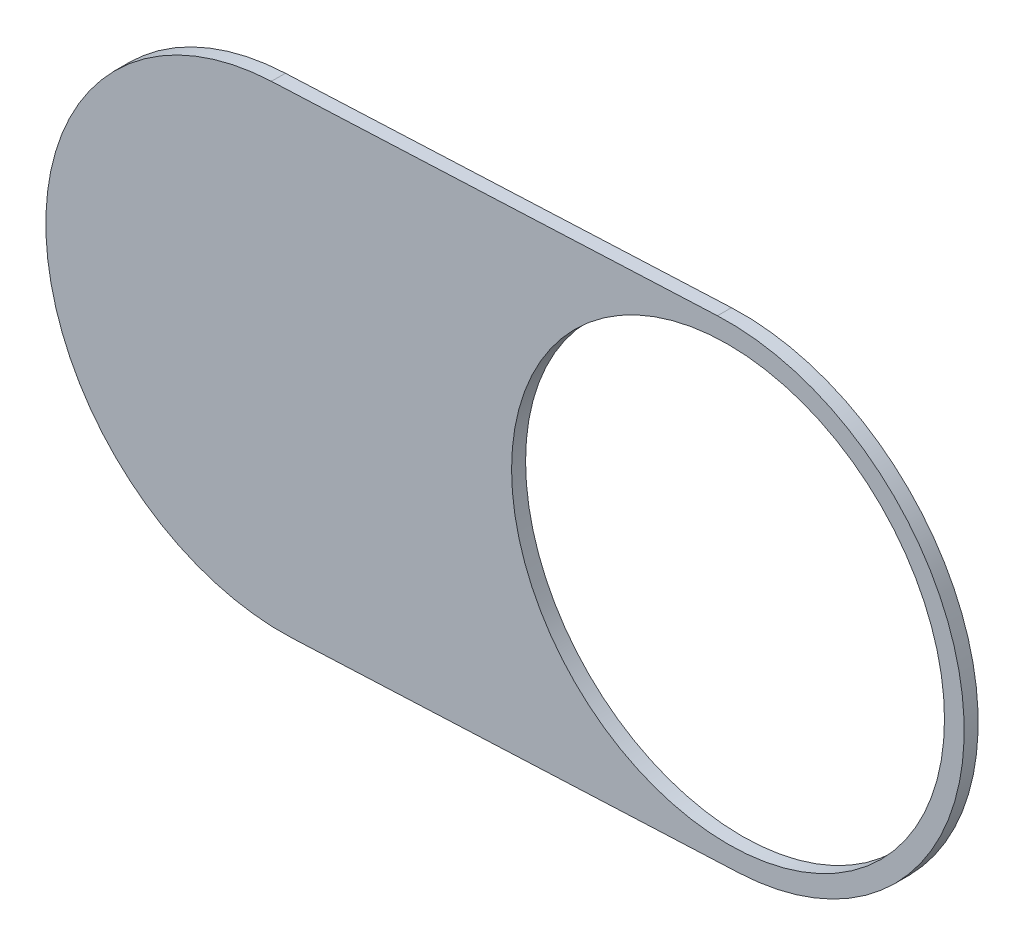
ISO-10303-21;
HEADER;
FILE_DESCRIPTION(('STEP AP214'),'2;1');
FILE_NAME('part.step','',(''),(''),'','','');
FILE_SCHEMA(('AUTOMOTIVE_DESIGN { 1 0 10303 214 1 1 1 1 }'));
ENDSEC;
DATA;
#1=APPLICATION_CONTEXT('core data for automotive mechanical design processes');
#2=APPLICATION_PROTOCOL_DEFINITION('international standard','automotive_design',2000,#1);
#3=PRODUCT_CONTEXT('',#1,'mechanical');
#4=PRODUCT('Part','Part','',(#3));
#5=PRODUCT_RELATED_PRODUCT_CATEGORY('part','',(#4));
#6=PRODUCT_DEFINITION_FORMATION('','',#4);
#7=PRODUCT_DEFINITION_CONTEXT('part definition',#1,'design');
#8=PRODUCT_DEFINITION('design','',#6,#7);
#9=PRODUCT_DEFINITION_SHAPE('','',#8);
#10=(LENGTH_UNIT() NAMED_UNIT(*) SI_UNIT(.MILLI.,.METRE.));
#11=(NAMED_UNIT(*) PLANE_ANGLE_UNIT() SI_UNIT($,.RADIAN.));
#12=(NAMED_UNIT(*) SI_UNIT($,.STERADIAN.) SOLID_ANGLE_UNIT());
#13=UNCERTAINTY_MEASURE_WITH_UNIT(LENGTH_MEASURE(1.E-05),#10,'distance_accuracy_value','');
#14=(GEOMETRIC_REPRESENTATION_CONTEXT(3) GLOBAL_UNCERTAINTY_ASSIGNED_CONTEXT((#13)) GLOBAL_UNIT_ASSIGNED_CONTEXT((#10,
#11,#12)) REPRESENTATION_CONTEXT('',''));
#15=CARTESIAN_POINT('',(0.,0.,0.));
#16=DIRECTION('',(0.,0.,1.));
#17=DIRECTION('',(1.,0.,0.));
#18=AXIS2_PLACEMENT_3D('',#15,#16,#17);
#19=CARTESIAN_POINT('',(102.43966558,69.98064998,0.));
#20=DIRECTION('',(-0.0447779902623201,0.998996962752174,0.));
#21=DIRECTION('',(0.998996962752174,0.0447779902623201,0.));
#22=AXIS2_PLACEMENT_3D('',#19,#20,#21);
#23=PLANE('',#22);
#24=DIRECTION('',(0.998996962752173,0.0447779902623201,0.));
#25=VECTOR('',#24,1.);
#26=CARTESIAN_POINT('',(102.43966558,69.98064998,0.03556));
#27=LINE('',#26,#25);
#28=CARTESIAN_POINT('',(102.43966558,69.98064998,0.03556));
#29=VERTEX_POINT('',#28);
#30=CARTESIAN_POINT('',(103.57301358,70.03144998,0.03556));
#31=VERTEX_POINT('',#30);
#32=EDGE_CURVE('E11',#29,#31,#27,.T.);
#33=ORIENTED_EDGE('',*,*,#32,.F.);
#34=DIRECTION('',(0.,0.,1.));
#35=VECTOR('',#34,1.);
#36=CARTESIAN_POINT('',(102.43966558,69.98064998,0.));
#37=LINE('',#36,#35);
#38=CARTESIAN_POINT('',(102.43966558,69.98064998,0.));
#39=VERTEX_POINT('',#38);
#40=EDGE_CURVE('E24',#39,#29,#37,.T.);
#41=ORIENTED_EDGE('',*,*,#40,.F.);
#42=DIRECTION('',(0.998996962752173,0.0447779902623201,0.));
#43=VECTOR('',#42,1.);
#44=CARTESIAN_POINT('',(102.43966558,69.98064998,0.));
#45=LINE('',#44,#43);
#46=CARTESIAN_POINT('',(103.57301358,70.03144998,0.));
#47=VERTEX_POINT('',#46);
#48=EDGE_CURVE('E96',#39,#47,#45,.T.);
#49=ORIENTED_EDGE('',*,*,#48,.T.);
#50=DIRECTION('',(0.,0.,1.));
#51=VECTOR('',#50,1.);
#52=CARTESIAN_POINT('',(103.57301358,70.03144998,0.));
#53=LINE('',#52,#51);
#54=EDGE_CURVE('E37',#47,#31,#53,.T.);
#55=ORIENTED_EDGE('',*,*,#54,.T.);
#56=EDGE_LOOP('',(#33,#41,#49,#55));
#57=FACE_BOUND('',#56,.T.);
#58=ADVANCED_FACE('F17',(#57),#23,.F.);
#59=CARTESIAN_POINT('',(102.4128,70.5800468,0.));
#60=DIRECTION('',(0.,0.,-1.));
#61=DIRECTION('',(-0.0447760719393731,0.99899704873522,0.));
#62=AXIS2_PLACEMENT_3D('',#59,#60,#61);
#63=CYLINDRICAL_SURFACE('',#62,0.599998589344049);
#64=CARTESIAN_POINT('',(102.4128,70.5800468,0.03556));
#65=DIRECTION('',(0.,0.,1.));
#66=DIRECTION('',(-0.0447760719393731,0.99899704873522,0.));
#67=AXIS2_PLACEMENT_3D('',#64,#65,#66);
#68=CIRCLE('',#67,0.599998589344049);
#69=CARTESIAN_POINT('',(102.38593442,71.17944362,0.03556));
#70=VERTEX_POINT('',#69);
#71=EDGE_CURVE('E92',#70,#29,#68,.T.);
#72=ORIENTED_EDGE('',*,*,#71,.F.);
#73=DIRECTION('',(0.,0.,1.));
#74=VECTOR('',#73,1.);
#75=CARTESIAN_POINT('',(102.38593442,71.17944362,0.));
#76=LINE('',#75,#74);
#77=CARTESIAN_POINT('',(102.38593442,71.17944362,0.));
#78=VERTEX_POINT('',#77);
#79=EDGE_CURVE('E90',#78,#70,#76,.T.);
#80=ORIENTED_EDGE('',*,*,#79,.F.);
#81=CARTESIAN_POINT('',(102.4128,70.5800468,0.));
#82=DIRECTION('',(0.,0.,1.));
#83=DIRECTION('',(-0.0447760719393731,0.99899704873522,0.));
#84=AXIS2_PLACEMENT_3D('',#81,#82,#83);
#85=CIRCLE('',#84,0.599998589344049);
#86=EDGE_CURVE('E88',#78,#39,#85,.T.);
#87=ORIENTED_EDGE('',*,*,#86,.T.);
#88=ORIENTED_EDGE('',*,*,#40,.T.);
#89=EDGE_LOOP('',(#72,#80,#87,#88));
#90=FACE_BOUND('',#89,.T.);
#91=ADVANCED_FACE('F111',(#90),#63,.T.);
#92=CARTESIAN_POINT('',(103.546148,70.6308468,0.));
#93=DIRECTION('',(0.,0.,-1.));
#94=DIRECTION('',(0.0447760719393505,-0.998997048735221,0.));
#95=AXIS2_PLACEMENT_3D('',#92,#93,#94);
#96=CYLINDRICAL_SURFACE('',#95,0.59999858934404);
#97=CARTESIAN_POINT('',(103.546148,70.6308468,0.03556));
#98=DIRECTION('',(0.,0.,1.));
#99=DIRECTION('',(0.0447760719393505,-0.998997048735221,0.));
#100=AXIS2_PLACEMENT_3D('',#97,#98,#99);
#101=CIRCLE('',#100,0.59999858934404);
#102=CARTESIAN_POINT('',(103.51928242,71.23024362,0.03556));
#103=VERTEX_POINT('',#102);
#104=EDGE_CURVE('E85',#31,#103,#101,.T.);
#105=ORIENTED_EDGE('',*,*,#104,.F.);
#106=ORIENTED_EDGE('',*,*,#54,.F.);
#107=CARTESIAN_POINT('',(103.546148,70.6308468,0.));
#108=DIRECTION('',(0.,0.,1.));
#109=DIRECTION('',(0.0447760719393505,-0.998997048735221,0.));
#110=AXIS2_PLACEMENT_3D('',#107,#108,#109);
#111=CIRCLE('',#110,0.59999858934404);
#112=CARTESIAN_POINT('',(103.51928242,71.23024362,0.));
#113=VERTEX_POINT('',#112);
#114=EDGE_CURVE('E82',#47,#113,#111,.T.);
#115=ORIENTED_EDGE('',*,*,#114,.T.);
#116=DIRECTION('',(0.,0.,1.));
#117=VECTOR('',#116,1.);
#118=CARTESIAN_POINT('',(103.51928242,71.23024362,0.));
#119=LINE('',#118,#117);
#120=EDGE_CURVE('E80',#113,#103,#119,.T.);
#121=ORIENTED_EDGE('',*,*,#120,.T.);
#122=EDGE_LOOP('',(#105,#106,#115,#121));
#123=FACE_BOUND('',#122,.T.);
#124=ADVANCED_FACE('F104',(#123),#96,.T.);
#125=CARTESIAN_POINT('',(103.51928242,71.23024362,0.));
#126=DIRECTION('',(0.0447779902623076,-0.998996962752174,0.));
#127=DIRECTION('',(-0.998996962752174,-0.0447779902623076,0.));
#128=AXIS2_PLACEMENT_3D('',#125,#126,#127);
#129=PLANE('',#128);
#130=DIRECTION('',(-0.998996962752174,-0.0447779902623076,0.));
#131=VECTOR('',#130,1.);
#132=CARTESIAN_POINT('',(103.51928242,71.23024362,0.03556));
#133=LINE('',#132,#131);
#134=EDGE_CURVE('E77',#103,#70,#133,.T.);
#135=ORIENTED_EDGE('',*,*,#134,.F.);
#136=ORIENTED_EDGE('',*,*,#120,.F.);
#137=DIRECTION('',(-0.998996962752174,-0.0447779902623076,0.));
#138=VECTOR('',#137,1.);
#139=CARTESIAN_POINT('',(103.51928242,71.23024362,0.));
#140=LINE('',#139,#138);
#141=EDGE_CURVE('E68',#113,#78,#140,.T.);
#142=ORIENTED_EDGE('',*,*,#141,.T.);
#143=ORIENTED_EDGE('',*,*,#79,.T.);
#144=EDGE_LOOP('',(#135,#136,#142,#143));
#145=FACE_BOUND('',#144,.T.);
#146=ADVANCED_FACE('F110',(#145),#129,.F.);
#147=CARTESIAN_POINT('',(103.546148,70.6308468,0.));
#148=DIRECTION('',(0.,0.,-1.));
#149=DIRECTION('',(1.,0.,0.));
#150=AXIS2_PLACEMENT_3D('',#147,#148,#149);
#151=CYLINDRICAL_SURFACE('',#150,0.5499989);
#152=DIRECTION('',(0.,0.,1.));
#153=VECTOR('',#152,1.);
#154=CARTESIAN_POINT('',(104.0961469,70.6308468,0.));
#155=LINE('',#154,#153);
#156=CARTESIAN_POINT('',(104.0961469,70.6308468,0.));
#157=VERTEX_POINT('',#156);
#158=CARTESIAN_POINT('',(104.0961469,70.6308468,0.03556));
#159=VERTEX_POINT('',#158);
#160=EDGE_CURVE('E62',#157,#159,#155,.T.);
#161=ORIENTED_EDGE('',*,*,#160,.T.);
#162=CARTESIAN_POINT('',(103.546148,70.6308468,0.03556));
#163=DIRECTION('',(0.,0.,1.));
#164=DIRECTION('',(1.,0.,0.));
#165=AXIS2_PLACEMENT_3D('',#162,#163,#164);
#166=CIRCLE('',#165,0.5499989);
#167=EDGE_CURVE('E67',#159,#159,#166,.T.);
#168=ORIENTED_EDGE('',*,*,#167,.T.);
#169=ORIENTED_EDGE('',*,*,#160,.F.);
#170=CARTESIAN_POINT('',(103.546148,70.6308468,0.));
#171=DIRECTION('',(0.,0.,1.));
#172=DIRECTION('',(1.,0.,0.));
#173=AXIS2_PLACEMENT_3D('',#170,#171,#172);
#174=CIRCLE('',#173,0.5499989);
#175=EDGE_CURVE('E65',#157,#157,#174,.T.);
#176=ORIENTED_EDGE('',*,*,#175,.F.);
#177=EDGE_LOOP('',(#161,#168,#169,#176));
#178=FACE_BOUND('',#177,.T.);
#179=ADVANCED_FACE('F64',(#178),#151,.F.);
#180=CARTESIAN_POINT('',(102.43966558,69.98064998,0.));
#181=DIRECTION('',(0.,0.,-1.));
#182=DIRECTION('',(-1.,0.,0.));
#183=AXIS2_PLACEMENT_3D('',#180,#181,#182);
#184=PLANE('',#183);
#185=ORIENTED_EDGE('',*,*,#48,.F.);
#186=ORIENTED_EDGE('',*,*,#86,.F.);
#187=ORIENTED_EDGE('',*,*,#141,.F.);
#188=ORIENTED_EDGE('',*,*,#114,.F.);
#189=EDGE_LOOP('',(#185,#186,#187,#188));
#190=FACE_BOUND('',#189,.T.);
#191=ORIENTED_EDGE('',*,*,#175,.T.);
#192=EDGE_LOOP('',(#191));
#193=FACE_BOUND('',#192,.T.);
#194=ADVANCED_FACE('F71',(#190,#193),#184,.T.);
#195=CARTESIAN_POINT('',(102.43966558,69.98064998,0.03556));
#196=DIRECTION('',(0.,0.,-1.));
#197=DIRECTION('',(-1.,0.,0.));
#198=AXIS2_PLACEMENT_3D('',#195,#196,#197);
#199=PLANE('',#198);
#200=ORIENTED_EDGE('',*,*,#134,.T.);
#201=ORIENTED_EDGE('',*,*,#71,.T.);
#202=ORIENTED_EDGE('',*,*,#32,.T.);
#203=ORIENTED_EDGE('',*,*,#104,.T.);
#204=EDGE_LOOP('',(#200,#201,#202,#203));
#205=FACE_BOUND('',#204,.T.);
#206=ORIENTED_EDGE('',*,*,#167,.F.);
#207=EDGE_LOOP('',(#206));
#208=FACE_BOUND('',#207,.T.);
#209=ADVANCED_FACE('F107',(#205,#208),#199,.F.);
#210=CLOSED_SHELL('',(#58,#91,#124,#146,#179,#194,#209));
#211=MANIFOLD_SOLID_BREP('B1',#210);
#212=ADVANCED_BREP_SHAPE_REPRESENTATION('',(#18,#211),#14);
#213=SHAPE_DEFINITION_REPRESENTATION(#9,#212);
ENDSEC;
END-ISO-10303-21;
